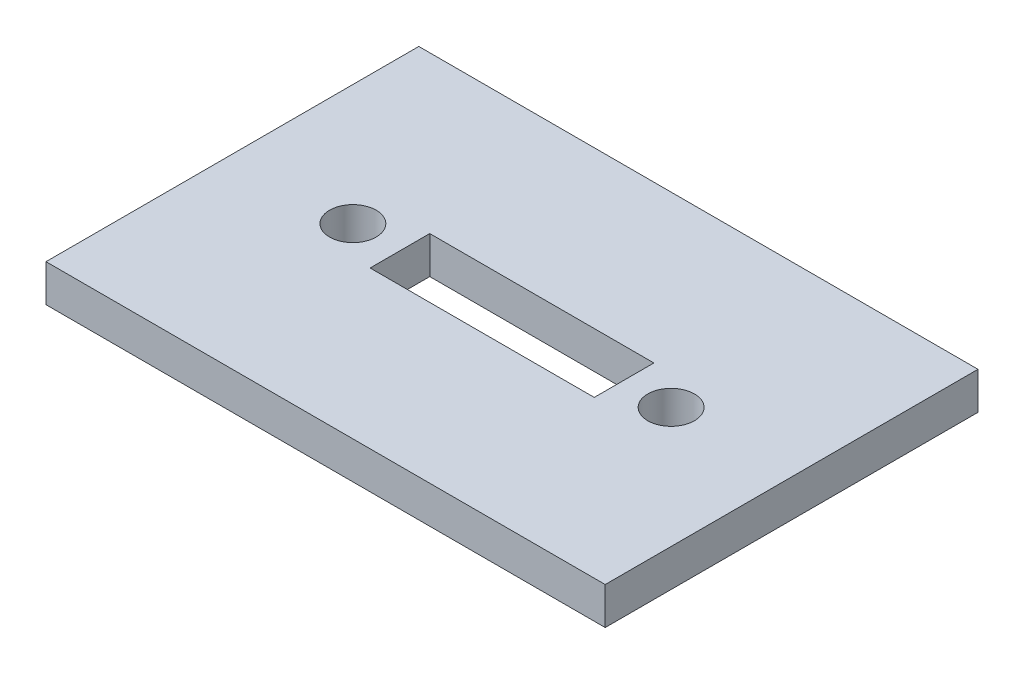
ISO-10303-21;
HEADER;
FILE_DESCRIPTION(('STEP AP214'),'2;1');
FILE_NAME('part.step','',(''),(''),'','','');
FILE_SCHEMA(('AUTOMOTIVE_DESIGN { 1 0 10303 214 1 1 1 1 }'));
ENDSEC;
DATA;
#1=APPLICATION_CONTEXT('core data for automotive mechanical design processes');
#2=APPLICATION_PROTOCOL_DEFINITION('international standard','automotive_design',2000,#1);
#3=PRODUCT_CONTEXT('',#1,'mechanical');
#4=PRODUCT('Part','Part','',(#3));
#5=PRODUCT_RELATED_PRODUCT_CATEGORY('part','',(#4));
#6=PRODUCT_DEFINITION_FORMATION('','',#4);
#7=PRODUCT_DEFINITION_CONTEXT('part definition',#1,'design');
#8=PRODUCT_DEFINITION('design','',#6,#7);
#9=PRODUCT_DEFINITION_SHAPE('','',#8);
#10=(LENGTH_UNIT() NAMED_UNIT(*) SI_UNIT(.MILLI.,.METRE.));
#11=(NAMED_UNIT(*) PLANE_ANGLE_UNIT() SI_UNIT($,.RADIAN.));
#12=(NAMED_UNIT(*) SI_UNIT($,.STERADIAN.) SOLID_ANGLE_UNIT());
#13=UNCERTAINTY_MEASURE_WITH_UNIT(LENGTH_MEASURE(1.E-05),#10,'distance_accuracy_value','');
#14=(GEOMETRIC_REPRESENTATION_CONTEXT(3) GLOBAL_UNCERTAINTY_ASSIGNED_CONTEXT((#13)) GLOBAL_UNIT_ASSIGNED_CONTEXT((#10,
#11,#12)) REPRESENTATION_CONTEXT('',''));
#15=CARTESIAN_POINT('',(0.,0.,0.));
#16=DIRECTION('',(0.,0.,1.));
#17=DIRECTION('',(1.,0.,0.));
#18=AXIS2_PLACEMENT_3D('',#15,#16,#17);
#19=CARTESIAN_POINT('',(0.,0.3175,0.));
#20=DIRECTION('',(1.,0.,0.));
#21=DIRECTION('',(0.,0.,-1.));
#22=AXIS2_PLACEMENT_3D('',#19,#20,#21);
#23=PLANE('',#22);
#24=DIRECTION('',(0.,0.,1.));
#25=VECTOR('',#24,1.);
#26=CARTESIAN_POINT('',(0.,0.,0.));
#27=LINE('',#26,#25);
#28=CARTESIAN_POINT('',(0.,0.,0.));
#29=VERTEX_POINT('',#28);
#30=CARTESIAN_POINT('',(0.,0.,3.175));
#31=VERTEX_POINT('',#30);
#32=EDGE_CURVE('E150',#29,#31,#27,.T.);
#33=ORIENTED_EDGE('',*,*,#32,.T.);
#34=DIRECTION('',(0.,-1.,0.));
#35=VECTOR('',#34,1.);
#36=CARTESIAN_POINT('',(0.,0.3175,3.175));
#37=LINE('',#36,#35);
#38=CARTESIAN_POINT('',(0.,0.3175,3.175));
#39=VERTEX_POINT('',#38);
#40=EDGE_CURVE('E11',#39,#31,#37,.T.);
#41=ORIENTED_EDGE('',*,*,#40,.F.);
#42=DIRECTION('',(0.,0.,1.));
#43=VECTOR('',#42,1.);
#44=CARTESIAN_POINT('',(0.,0.3175,0.));
#45=LINE('',#44,#43);
#46=CARTESIAN_POINT('',(0.,0.3175,0.));
#47=VERTEX_POINT('',#46);
#48=EDGE_CURVE('E151',#47,#39,#45,.T.);
#49=ORIENTED_EDGE('',*,*,#48,.F.);
#50=DIRECTION('',(0.,-1.,0.));
#51=VECTOR('',#50,1.);
#52=CARTESIAN_POINT('',(0.,0.3175,0.));
#53=LINE('',#52,#51);
#54=EDGE_CURVE('E161',#47,#29,#53,.T.);
#55=ORIENTED_EDGE('',*,*,#54,.T.);
#56=EDGE_LOOP('',(#33,#41,#49,#55));
#57=FACE_BOUND('',#56,.T.);
#58=ADVANCED_FACE('F40',(#57),#23,.F.);
#59=CARTESIAN_POINT('',(0.,0.3175,3.175));
#60=DIRECTION('',(0.,0.,-1.));
#61=DIRECTION('',(-1.,0.,0.));
#62=AXIS2_PLACEMENT_3D('',#59,#60,#61);
#63=PLANE('',#62);
#64=DIRECTION('',(1.,0.,0.));
#65=VECTOR('',#64,1.);
#66=CARTESIAN_POINT('',(0.,0.,3.175));
#67=LINE('',#66,#65);
#68=CARTESIAN_POINT('',(4.7625,0.,3.175));
#69=VERTEX_POINT('',#68);
#70=EDGE_CURVE('E164',#31,#69,#67,.T.);
#71=ORIENTED_EDGE('',*,*,#70,.T.);
#72=DIRECTION('',(0.,-1.,0.));
#73=VECTOR('',#72,1.);
#74=CARTESIAN_POINT('',(4.7625,0.3175,3.175));
#75=LINE('',#74,#73);
#76=CARTESIAN_POINT('',(4.7625,0.3175,3.175));
#77=VERTEX_POINT('',#76);
#78=EDGE_CURVE('E48',#77,#69,#75,.T.);
#79=ORIENTED_EDGE('',*,*,#78,.F.);
#80=DIRECTION('',(1.,0.,0.));
#81=VECTOR('',#80,1.);
#82=CARTESIAN_POINT('',(0.,0.3175,3.175));
#83=LINE('',#82,#81);
#84=EDGE_CURVE('E154',#39,#77,#83,.T.);
#85=ORIENTED_EDGE('',*,*,#84,.F.);
#86=ORIENTED_EDGE('',*,*,#40,.T.);
#87=EDGE_LOOP('',(#71,#79,#85,#86));
#88=FACE_BOUND('',#87,.T.);
#89=ADVANCED_FACE('F194',(#88),#63,.F.);
#90=CARTESIAN_POINT('',(4.7625,0.3175,0.));
#91=DIRECTION('',(-1.,0.,0.));
#92=DIRECTION('',(0.,0.,1.));
#93=AXIS2_PLACEMENT_3D('',#90,#91,#92);
#94=PLANE('',#93);
#95=DIRECTION('',(0.,0.,-1.));
#96=VECTOR('',#95,1.);
#97=CARTESIAN_POINT('',(4.7625,0.,0.));
#98=LINE('',#97,#96);
#99=CARTESIAN_POINT('',(4.7625,0.,0.));
#100=VERTEX_POINT('',#99);
#101=EDGE_CURVE('E166',#69,#100,#98,.T.);
#102=ORIENTED_EDGE('',*,*,#101,.T.);
#103=DIRECTION('',(0.,-1.,0.));
#104=VECTOR('',#103,1.);
#105=CARTESIAN_POINT('',(4.7625,0.3175,0.));
#106=LINE('',#105,#104);
#107=CARTESIAN_POINT('',(4.7625,0.3175,0.));
#108=VERTEX_POINT('',#107);
#109=EDGE_CURVE('E171',#108,#100,#106,.T.);
#110=ORIENTED_EDGE('',*,*,#109,.F.);
#111=DIRECTION('',(0.,0.,-1.));
#112=VECTOR('',#111,1.);
#113=CARTESIAN_POINT('',(4.7625,0.3175,0.));
#114=LINE('',#113,#112);
#115=EDGE_CURVE('E157',#77,#108,#114,.T.);
#116=ORIENTED_EDGE('',*,*,#115,.F.);
#117=ORIENTED_EDGE('',*,*,#78,.T.);
#118=EDGE_LOOP('',(#102,#110,#116,#117));
#119=FACE_BOUND('',#118,.T.);
#120=ADVANCED_FACE('F179',(#119),#94,.F.);
#121=CARTESIAN_POINT('',(0.,0.3175,0.));
#122=DIRECTION('',(0.,0.,1.));
#123=DIRECTION('',(1.,0.,0.));
#124=AXIS2_PLACEMENT_3D('',#121,#122,#123);
#125=PLANE('',#124);
#126=DIRECTION('',(-1.,0.,0.));
#127=VECTOR('',#126,1.);
#128=CARTESIAN_POINT('',(0.,0.,0.));
#129=LINE('',#128,#127);
#130=EDGE_CURVE('E155',#100,#29,#129,.T.);
#131=ORIENTED_EDGE('',*,*,#130,.T.);
#132=ORIENTED_EDGE('',*,*,#54,.F.);
#133=DIRECTION('',(-1.,0.,0.));
#134=VECTOR('',#133,1.);
#135=CARTESIAN_POINT('',(0.,0.3175,0.));
#136=LINE('',#135,#134);
#137=EDGE_CURVE('E159',#108,#47,#136,.T.);
#138=ORIENTED_EDGE('',*,*,#137,.F.);
#139=ORIENTED_EDGE('',*,*,#109,.T.);
#140=EDGE_LOOP('',(#131,#132,#138,#139));
#141=FACE_BOUND('',#140,.T.);
#142=ADVANCED_FACE('F187',(#141),#125,.F.);
#143=CARTESIAN_POINT('',(0.,0.3175,0.));
#144=DIRECTION('',(0.,1.,0.));
#145=DIRECTION('',(0.,0.,1.));
#146=AXIS2_PLACEMENT_3D('',#143,#144,#145);
#147=PLANE('',#146);
#148=DIRECTION('',(0.,0.,1.));
#149=VECTOR('',#148,1.);
#150=CARTESIAN_POINT('',(1.42677234447319,0.3175,1.8415));
#151=LINE('',#150,#149);
#152=CARTESIAN_POINT('',(1.42677234447319,0.3175,1.3335));
#153=VERTEX_POINT('',#152);
#154=CARTESIAN_POINT('',(1.42677234447319,0.3175,1.8415));
#155=VERTEX_POINT('',#154);
#156=EDGE_CURVE('E55',#153,#155,#151,.T.);
#157=ORIENTED_EDGE('',*,*,#156,.F.);
#158=DIRECTION('',(-1.,0.,0.));
#159=VECTOR('',#158,1.);
#160=CARTESIAN_POINT('',(3.33572765552681,0.3175,1.3335));
#161=LINE('',#160,#159);
#162=CARTESIAN_POINT('',(3.33572765552681,0.3175,1.3335));
#163=VERTEX_POINT('',#162);
#164=EDGE_CURVE('E123',#163,#153,#161,.T.);
#165=ORIENTED_EDGE('',*,*,#164,.F.);
#166=DIRECTION('',(0.,0.,-1.));
#167=VECTOR('',#166,1.);
#168=CARTESIAN_POINT('',(3.33572765552681,0.3175,1.8415));
#169=LINE('',#168,#167);
#170=CARTESIAN_POINT('',(3.33572765552681,0.3175,1.8415));
#171=VERTEX_POINT('',#170);
#172=EDGE_CURVE('E126',#171,#163,#169,.T.);
#173=ORIENTED_EDGE('',*,*,#172,.F.);
#174=DIRECTION('',(1.,0.,0.));
#175=VECTOR('',#174,1.);
#176=CARTESIAN_POINT('',(3.33572765552681,0.3175,1.8415));
#177=LINE('',#176,#175);
#178=EDGE_CURVE('E132',#155,#171,#177,.T.);
#179=ORIENTED_EDGE('',*,*,#178,.F.);
#180=EDGE_LOOP('',(#157,#165,#173,#179));
#181=FACE_BOUND('',#180,.T.);
#182=CARTESIAN_POINT('',(3.73634,0.317500000000002,1.5875));
#183=DIRECTION('',(0.,1.,0.));
#184=DIRECTION('',(0.,0.,1.));
#185=AXIS2_PLACEMENT_3D('',#182,#183,#184);
#186=CIRCLE('',#185,0.19850099999999);
#187=CARTESIAN_POINT('',(3.73634,0.317500000000002,1.78600099999999));
#188=VERTEX_POINT('',#187);
#189=EDGE_CURVE('E138',#188,#188,#186,.T.);
#190=ORIENTED_EDGE('',*,*,#189,.F.);
#191=EDGE_LOOP('',(#190));
#192=FACE_BOUND('',#191,.T.);
#193=CARTESIAN_POINT('',(1.02616,0.317500000000002,1.5875));
#194=DIRECTION('',(0.,1.,0.));
#195=DIRECTION('',(0.,0.,1.));
#196=AXIS2_PLACEMENT_3D('',#193,#194,#195);
#197=CIRCLE('',#196,0.19850099999999);
#198=CARTESIAN_POINT('',(1.02616,0.317500000000002,1.78600099999999));
#199=VERTEX_POINT('',#198);
#200=EDGE_CURVE('E144',#199,#199,#197,.T.);
#201=ORIENTED_EDGE('',*,*,#200,.F.);
#202=EDGE_LOOP('',(#201));
#203=FACE_BOUND('',#202,.T.);
#204=ORIENTED_EDGE('',*,*,#48,.T.);
#205=ORIENTED_EDGE('',*,*,#84,.T.);
#206=ORIENTED_EDGE('',*,*,#115,.T.);
#207=ORIENTED_EDGE('',*,*,#137,.T.);
#208=EDGE_LOOP('',(#204,#205,#206,#207));
#209=FACE_BOUND('',#208,.T.);
#210=ADVANCED_FACE('F193',(#181,#192,#203,#209),#147,.T.);
#211=CARTESIAN_POINT('',(0.,0.,0.));
#212=DIRECTION('',(0.,1.,0.));
#213=DIRECTION('',(0.,0.,1.));
#214=AXIS2_PLACEMENT_3D('',#211,#212,#213);
#215=PLANE('',#214);
#216=DIRECTION('',(-1.,0.,0.));
#217=VECTOR('',#216,1.);
#218=CARTESIAN_POINT('',(3.33572765552681,0.,1.3335));
#219=LINE('',#218,#217);
#220=CARTESIAN_POINT('',(3.33572765552681,0.,1.3335));
#221=VERTEX_POINT('',#220);
#222=CARTESIAN_POINT('',(1.42677234447319,0.,1.3335));
#223=VERTEX_POINT('',#222);
#224=EDGE_CURVE('E113',#221,#223,#219,.T.);
#225=ORIENTED_EDGE('',*,*,#224,.T.);
#226=DIRECTION('',(0.,0.,1.));
#227=VECTOR('',#226,1.);
#228=CARTESIAN_POINT('',(1.42677234447319,0.,1.8415));
#229=LINE('',#228,#227);
#230=CARTESIAN_POINT('',(1.42677234447319,0.,1.8415));
#231=VERTEX_POINT('',#230);
#232=EDGE_CURVE('E107',#223,#231,#229,.T.);
#233=ORIENTED_EDGE('',*,*,#232,.T.);
#234=DIRECTION('',(1.,0.,0.));
#235=VECTOR('',#234,1.);
#236=CARTESIAN_POINT('',(3.33572765552681,0.,1.8415));
#237=LINE('',#236,#235);
#238=CARTESIAN_POINT('',(3.33572765552681,0.,1.8415));
#239=VERTEX_POINT('',#238);
#240=EDGE_CURVE('E116',#231,#239,#237,.T.);
#241=ORIENTED_EDGE('',*,*,#240,.T.);
#242=DIRECTION('',(0.,0.,-1.));
#243=VECTOR('',#242,1.);
#244=CARTESIAN_POINT('',(3.33572765552681,0.,1.8415));
#245=LINE('',#244,#243);
#246=EDGE_CURVE('E63',#239,#221,#245,.T.);
#247=ORIENTED_EDGE('',*,*,#246,.T.);
#248=EDGE_LOOP('',(#225,#233,#241,#247));
#249=FACE_BOUND('',#248,.T.);
#250=CARTESIAN_POINT('',(3.73634,0.,1.5875));
#251=DIRECTION('',(0.,1.,0.));
#252=DIRECTION('',(0.,0.,1.));
#253=AXIS2_PLACEMENT_3D('',#250,#251,#252);
#254=CIRCLE('',#253,0.198500999999989);
#255=CARTESIAN_POINT('',(3.73634,0.,1.78600099999999));
#256=VERTEX_POINT('',#255);
#257=EDGE_CURVE('E43',#256,#256,#254,.T.);
#258=ORIENTED_EDGE('',*,*,#257,.T.);
#259=EDGE_LOOP('',(#258));
#260=FACE_BOUND('',#259,.T.);
#261=CARTESIAN_POINT('',(1.02616,0.,1.5875));
#262=DIRECTION('',(0.,1.,0.));
#263=DIRECTION('',(0.,0.,1.));
#264=AXIS2_PLACEMENT_3D('',#261,#262,#263);
#265=CIRCLE('',#264,0.198500999999989);
#266=CARTESIAN_POINT('',(1.02616,0.,1.78600099999999));
#267=VERTEX_POINT('',#266);
#268=EDGE_CURVE('E147',#267,#267,#265,.T.);
#269=ORIENTED_EDGE('',*,*,#268,.T.);
#270=EDGE_LOOP('',(#269));
#271=FACE_BOUND('',#270,.T.);
#272=ORIENTED_EDGE('',*,*,#32,.F.);
#273=ORIENTED_EDGE('',*,*,#130,.F.);
#274=ORIENTED_EDGE('',*,*,#101,.F.);
#275=ORIENTED_EDGE('',*,*,#70,.F.);
#276=EDGE_LOOP('',(#272,#273,#274,#275));
#277=FACE_BOUND('',#276,.T.);
#278=ADVANCED_FACE('F120',(#249,#260,#271,#277),#215,.F.);
#279=CARTESIAN_POINT('',(1.02616,0.3175,1.5875));
#280=DIRECTION('',(0.,1.,0.));
#281=DIRECTION('',(0.,0.,1.));
#282=AXIS2_PLACEMENT_3D('',#279,#280,#281);
#283=CYLINDRICAL_SURFACE('',#282,0.198500999999989);
#284=ORIENTED_EDGE('',*,*,#200,.T.);
#285=EDGE_LOOP('',(#284));
#286=FACE_BOUND('',#285,.T.);
#287=ORIENTED_EDGE('',*,*,#268,.F.);
#288=EDGE_LOOP('',(#287));
#289=FACE_BOUND('',#288,.T.);
#290=ADVANCED_FACE('F206',(#286,#289),#283,.F.);
#291=CARTESIAN_POINT('',(3.73634,0.3175,1.5875));
#292=DIRECTION('',(0.,1.,0.));
#293=DIRECTION('',(0.,0.,1.));
#294=AXIS2_PLACEMENT_3D('',#291,#292,#293);
#295=CYLINDRICAL_SURFACE('',#294,0.198500999999989);
#296=ORIENTED_EDGE('',*,*,#189,.T.);
#297=EDGE_LOOP('',(#296));
#298=FACE_BOUND('',#297,.T.);
#299=ORIENTED_EDGE('',*,*,#257,.F.);
#300=EDGE_LOOP('',(#299));
#301=FACE_BOUND('',#300,.T.);
#302=ADVANCED_FACE('F212',(#298,#301),#295,.F.);
#303=CARTESIAN_POINT('',(1.42677234447319,0.,1.8415));
#304=DIRECTION('',(-1.,0.,0.));
#305=DIRECTION('',(0.,0.,1.));
#306=AXIS2_PLACEMENT_3D('',#303,#304,#305);
#307=PLANE('',#306);
#308=ORIENTED_EDGE('',*,*,#156,.T.);
#309=DIRECTION('',(0.,1.,0.));
#310=VECTOR('',#309,1.);
#311=CARTESIAN_POINT('',(1.42677234447319,0.,1.8415));
#312=LINE('',#311,#310);
#313=EDGE_CURVE('E103',#231,#155,#312,.T.);
#314=ORIENTED_EDGE('',*,*,#313,.F.);
#315=ORIENTED_EDGE('',*,*,#232,.F.);
#316=DIRECTION('',(0.,1.,0.));
#317=VECTOR('',#316,1.);
#318=CARTESIAN_POINT('',(1.42677234447319,0.,1.3335));
#319=LINE('',#318,#317);
#320=EDGE_CURVE('E136',#223,#153,#319,.T.);
#321=ORIENTED_EDGE('',*,*,#320,.T.);
#322=EDGE_LOOP('',(#308,#314,#315,#321));
#323=FACE_BOUND('',#322,.T.);
#324=ADVANCED_FACE('F105',(#323),#307,.F.);
#325=CARTESIAN_POINT('',(3.33572765552681,0.,1.3335));
#326=DIRECTION('',(0.,0.,-1.));
#327=DIRECTION('',(-1.,0.,0.));
#328=AXIS2_PLACEMENT_3D('',#325,#326,#327);
#329=PLANE('',#328);
#330=ORIENTED_EDGE('',*,*,#164,.T.);
#331=ORIENTED_EDGE('',*,*,#320,.F.);
#332=ORIENTED_EDGE('',*,*,#224,.F.);
#333=DIRECTION('',(0.,1.,0.));
#334=VECTOR('',#333,1.);
#335=CARTESIAN_POINT('',(3.33572765552681,0.,1.3335));
#336=LINE('',#335,#334);
#337=EDGE_CURVE('E139',#221,#163,#336,.T.);
#338=ORIENTED_EDGE('',*,*,#337,.T.);
#339=EDGE_LOOP('',(#330,#331,#332,#338));
#340=FACE_BOUND('',#339,.T.);
#341=ADVANCED_FACE('F219',(#340),#329,.F.);
#342=CARTESIAN_POINT('',(3.33572765552681,0.,1.8415));
#343=DIRECTION('',(1.,0.,0.));
#344=DIRECTION('',(0.,0.,-1.));
#345=AXIS2_PLACEMENT_3D('',#342,#343,#344);
#346=PLANE('',#345);
#347=ORIENTED_EDGE('',*,*,#172,.T.);
#348=ORIENTED_EDGE('',*,*,#337,.F.);
#349=ORIENTED_EDGE('',*,*,#246,.F.);
#350=DIRECTION('',(0.,1.,0.));
#351=VECTOR('',#350,1.);
#352=CARTESIAN_POINT('',(3.33572765552681,0.,1.8415));
#353=LINE('',#352,#351);
#354=EDGE_CURVE('E112',#239,#171,#353,.T.);
#355=ORIENTED_EDGE('',*,*,#354,.T.);
#356=EDGE_LOOP('',(#347,#348,#349,#355));
#357=FACE_BOUND('',#356,.T.);
#358=ADVANCED_FACE('F222',(#357),#346,.F.);
#359=CARTESIAN_POINT('',(3.33572765552681,0.,1.8415));
#360=DIRECTION('',(0.,0.,1.));
#361=DIRECTION('',(1.,0.,0.));
#362=AXIS2_PLACEMENT_3D('',#359,#360,#361);
#363=PLANE('',#362);
#364=ORIENTED_EDGE('',*,*,#178,.T.);
#365=ORIENTED_EDGE('',*,*,#354,.F.);
#366=ORIENTED_EDGE('',*,*,#240,.F.);
#367=ORIENTED_EDGE('',*,*,#313,.T.);
#368=EDGE_LOOP('',(#364,#365,#366,#367));
#369=FACE_BOUND('',#368,.T.);
#370=ADVANCED_FACE('F117',(#369),#363,.F.);
#371=CLOSED_SHELL('',(#58,#89,#120,#142,#210,#278,#290,#302,#324,#341,#358,#370));
#372=MANIFOLD_SOLID_BREP('B2',#371);
#373=ADVANCED_BREP_SHAPE_REPRESENTATION('',(#18,#372),#14);
#374=SHAPE_DEFINITION_REPRESENTATION(#9,#373);
ENDSEC;
END-ISO-10303-21;
